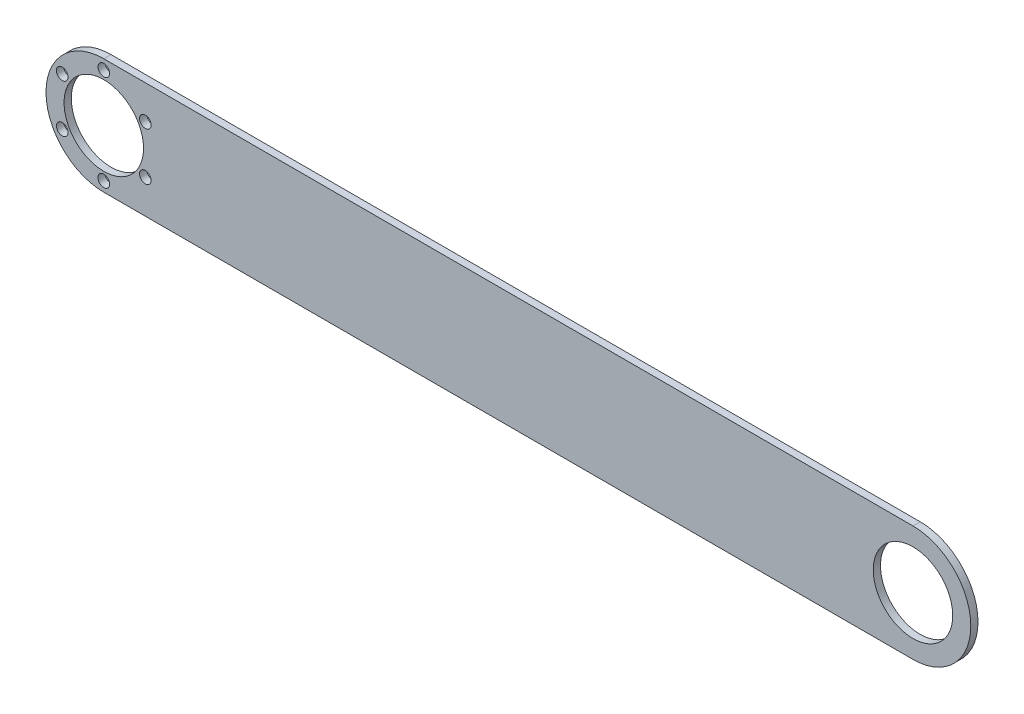
ISO-10303-21;
HEADER;
FILE_DESCRIPTION(('STEP AP214'),'2;1');
FILE_NAME('part.step','',(''),(''),'','','');
FILE_SCHEMA(('AUTOMOTIVE_DESIGN { 1 0 10303 214 1 1 1 1 }'));
ENDSEC;
DATA;
#1=APPLICATION_CONTEXT('core data for automotive mechanical design processes');
#2=APPLICATION_PROTOCOL_DEFINITION('international standard','automotive_design',2000,#1);
#3=PRODUCT_CONTEXT('',#1,'mechanical');
#4=PRODUCT('Part','Part','',(#3));
#5=PRODUCT_RELATED_PRODUCT_CATEGORY('part','',(#4));
#6=PRODUCT_DEFINITION_FORMATION('','',#4);
#7=PRODUCT_DEFINITION_CONTEXT('part definition',#1,'design');
#8=PRODUCT_DEFINITION('design','',#6,#7);
#9=PRODUCT_DEFINITION_SHAPE('','',#8);
#10=(LENGTH_UNIT() NAMED_UNIT(*) SI_UNIT(.MILLI.,.METRE.));
#11=(NAMED_UNIT(*) PLANE_ANGLE_UNIT() SI_UNIT($,.RADIAN.));
#12=(NAMED_UNIT(*) SI_UNIT($,.STERADIAN.) SOLID_ANGLE_UNIT());
#13=UNCERTAINTY_MEASURE_WITH_UNIT(LENGTH_MEASURE(1.E-05),#10,'distance_accuracy_value','');
#14=(GEOMETRIC_REPRESENTATION_CONTEXT(3) GLOBAL_UNCERTAINTY_ASSIGNED_CONTEXT((#13)) GLOBAL_UNIT_ASSIGNED_CONTEXT((#10,
#11,#12)) REPRESENTATION_CONTEXT('',''));
#15=CARTESIAN_POINT('',(0.,0.,0.));
#16=DIRECTION('',(0.,0.,1.));
#17=DIRECTION('',(1.,0.,0.));
#18=AXIS2_PLACEMENT_3D('',#15,#16,#17);
#19=CARTESIAN_POINT('',(0.,25.4,3.175));
#20=DIRECTION('',(0.,0.,-1.));
#21=DIRECTION('',(-1.,0.,0.));
#22=AXIS2_PLACEMENT_3D('',#19,#20,#21);
#23=CYLINDRICAL_SURFACE('',#22,25.4);
#24=CARTESIAN_POINT('',(0.,25.4,0.));
#25=DIRECTION('',(0.,0.,1.));
#26=DIRECTION('',(1.,0.,0.));
#27=AXIS2_PLACEMENT_3D('',#24,#25,#26);
#28=CIRCLE('',#27,25.4);
#29=CARTESIAN_POINT('',(0.,50.8,0.));
#30=VERTEX_POINT('',#29);
#31=CARTESIAN_POINT('',(0.,0.,0.));
#32=VERTEX_POINT('',#31);
#33=EDGE_CURVE('E97',#30,#32,#28,.T.);
#34=ORIENTED_EDGE('',*,*,#33,.T.);
#35=DIRECTION('',(0.,0.,-1.));
#36=VECTOR('',#35,1.);
#37=CARTESIAN_POINT('',(0.,0.,3.175));
#38=LINE('',#37,#36);
#39=CARTESIAN_POINT('',(0.,0.,3.175));
#40=VERTEX_POINT('',#39);
#41=EDGE_CURVE('E11',#40,#32,#38,.T.);
#42=ORIENTED_EDGE('',*,*,#41,.F.);
#43=CARTESIAN_POINT('',(0.,25.4,3.175));
#44=DIRECTION('',(0.,0.,1.));
#45=DIRECTION('',(1.,0.,0.));
#46=AXIS2_PLACEMENT_3D('',#43,#44,#45);
#47=CIRCLE('',#46,25.4);
#48=CARTESIAN_POINT('',(0.,50.8,3.175));
#49=VERTEX_POINT('',#48);
#50=EDGE_CURVE('E85',#49,#40,#47,.T.);
#51=ORIENTED_EDGE('',*,*,#50,.F.);
#52=DIRECTION('',(0.,0.,-1.));
#53=VECTOR('',#52,1.);
#54=CARTESIAN_POINT('',(0.,50.8,3.175));
#55=LINE('',#54,#53);
#56=EDGE_CURVE('E93',#49,#30,#55,.T.);
#57=ORIENTED_EDGE('',*,*,#56,.T.);
#58=EDGE_LOOP('',(#34,#42,#51,#57));
#59=FACE_BOUND('',#58,.T.);
#60=ADVANCED_FACE('F34',(#59),#23,.T.);
#61=CARTESIAN_POINT('',(0.,0.,3.175));
#62=DIRECTION('',(0.,1.,0.));
#63=DIRECTION('',(0.,0.,1.));
#64=AXIS2_PLACEMENT_3D('',#61,#62,#63);
#65=PLANE('',#64);
#66=DIRECTION('',(1.,0.,0.));
#67=VECTOR('',#66,1.);
#68=CARTESIAN_POINT('',(0.,0.,0.));
#69=LINE('',#68,#67);
#70=CARTESIAN_POINT('',(355.6,0.,0.));
#71=VERTEX_POINT('',#70);
#72=EDGE_CURVE('E89',#32,#71,#69,.T.);
#73=ORIENTED_EDGE('',*,*,#72,.T.);
#74=DIRECTION('',(0.,0.,-1.));
#75=VECTOR('',#74,1.);
#76=CARTESIAN_POINT('',(355.6,0.,3.175));
#77=LINE('',#76,#75);
#78=CARTESIAN_POINT('',(355.6,0.,3.175));
#79=VERTEX_POINT('',#78);
#80=EDGE_CURVE('E42',#79,#71,#77,.T.);
#81=ORIENTED_EDGE('',*,*,#80,.F.);
#82=DIRECTION('',(1.,0.,0.));
#83=VECTOR('',#82,1.);
#84=CARTESIAN_POINT('',(0.,0.,3.175));
#85=LINE('',#84,#83);
#86=EDGE_CURVE('E80',#40,#79,#85,.T.);
#87=ORIENTED_EDGE('',*,*,#86,.F.);
#88=ORIENTED_EDGE('',*,*,#41,.T.);
#89=EDGE_LOOP('',(#73,#81,#87,#88));
#90=FACE_BOUND('',#89,.T.);
#91=ADVANCED_FACE('F88',(#90),#65,.F.);
#92=CARTESIAN_POINT('',(355.6,25.4,3.175));
#93=DIRECTION('',(0.,0.,-1.));
#94=DIRECTION('',(-1.,0.,0.));
#95=AXIS2_PLACEMENT_3D('',#92,#93,#94);
#96=CYLINDRICAL_SURFACE('',#95,25.4);
#97=CARTESIAN_POINT('',(355.6,25.4,0.));
#98=DIRECTION('',(0.,0.,1.));
#99=DIRECTION('',(1.,0.,0.));
#100=AXIS2_PLACEMENT_3D('',#97,#98,#99);
#101=CIRCLE('',#100,25.4);
#102=CARTESIAN_POINT('',(355.6,50.8,0.));
#103=VERTEX_POINT('',#102);
#104=EDGE_CURVE('E67',#71,#103,#101,.T.);
#105=ORIENTED_EDGE('',*,*,#104,.T.);
#106=DIRECTION('',(0.,0.,-1.));
#107=VECTOR('',#106,1.);
#108=CARTESIAN_POINT('',(355.6,50.8,3.175));
#109=LINE('',#108,#107);
#110=CARTESIAN_POINT('',(355.6,50.8,3.175));
#111=VERTEX_POINT('',#110);
#112=EDGE_CURVE('E90',#111,#103,#109,.T.);
#113=ORIENTED_EDGE('',*,*,#112,.F.);
#114=CARTESIAN_POINT('',(355.6,25.4,3.175));
#115=DIRECTION('',(0.,0.,1.));
#116=DIRECTION('',(1.,0.,0.));
#117=AXIS2_PLACEMENT_3D('',#114,#115,#116);
#118=CIRCLE('',#117,25.4);
#119=EDGE_CURVE('E83',#79,#111,#118,.T.);
#120=ORIENTED_EDGE('',*,*,#119,.F.);
#121=ORIENTED_EDGE('',*,*,#80,.T.);
#122=EDGE_LOOP('',(#105,#113,#120,#121));
#123=FACE_BOUND('',#122,.T.);
#124=ADVANCED_FACE('F91',(#123),#96,.T.);
#125=CARTESIAN_POINT('',(0.,50.8,3.175));
#126=DIRECTION('',(0.,-1.,0.));
#127=DIRECTION('',(0.,0.,-1.));
#128=AXIS2_PLACEMENT_3D('',#125,#126,#127);
#129=PLANE('',#128);
#130=DIRECTION('',(-1.,0.,0.));
#131=VECTOR('',#130,1.);
#132=CARTESIAN_POINT('',(0.,50.8,0.));
#133=LINE('',#132,#131);
#134=EDGE_CURVE('E73',#103,#30,#133,.T.);
#135=ORIENTED_EDGE('',*,*,#134,.T.);
#136=ORIENTED_EDGE('',*,*,#56,.F.);
#137=DIRECTION('',(-1.,0.,0.));
#138=VECTOR('',#137,1.);
#139=CARTESIAN_POINT('',(0.,50.8,3.175));
#140=LINE('',#139,#138);
#141=EDGE_CURVE('E50',#111,#49,#140,.T.);
#142=ORIENTED_EDGE('',*,*,#141,.F.);
#143=ORIENTED_EDGE('',*,*,#112,.T.);
#144=EDGE_LOOP('',(#135,#136,#142,#143));
#145=FACE_BOUND('',#144,.T.);
#146=ADVANCED_FACE('F105',(#145),#129,.F.);
#147=CARTESIAN_POINT('',(0.,25.4,3.175));
#148=DIRECTION('',(0.,0.,1.));
#149=DIRECTION('',(1.,0.,0.));
#150=AXIS2_PLACEMENT_3D('',#147,#148,#149);
#151=PLANE('',#150);
#152=CARTESIAN_POINT('',(18.2575475625839,35.9410000000005,3.175));
#153=DIRECTION('',(0.,0.,1.));
#154=DIRECTION('',(1.,0.,0.));
#155=AXIS2_PLACEMENT_3D('',#152,#153,#154);
#156=CIRCLE('',#155,2.55269999999999);
#157=CARTESIAN_POINT('',(20.8102475625838,35.9410000000005,3.175));
#158=VERTEX_POINT('',#157);
#159=EDGE_CURVE('E155',#158,#158,#156,.T.);
#160=ORIENTED_EDGE('',*,*,#159,.F.);
#161=EDGE_LOOP('',(#160));
#162=FACE_BOUND('',#161,.T.);
#163=CARTESIAN_POINT('',(18.2575475625844,14.8590000000004,3.175));
#164=DIRECTION('',(0.,0.,1.));
#165=DIRECTION('',(1.,0.,0.));
#166=AXIS2_PLACEMENT_3D('',#163,#164,#165);
#167=CIRCLE('',#166,2.55269999999999);
#168=CARTESIAN_POINT('',(20.8102475625844,14.8590000000004,3.175));
#169=VERTEX_POINT('',#168);
#170=EDGE_CURVE('E149',#169,#169,#167,.T.);
#171=ORIENTED_EDGE('',*,*,#170,.F.);
#172=EDGE_LOOP('',(#171));
#173=FACE_BOUND('',#172,.T.);
#174=CARTESIAN_POINT('',(1.04083093572472E-12,4.318,3.175));
#175=DIRECTION('',(0.,0.,1.));
#176=DIRECTION('',(1.,0.,0.));
#177=AXIS2_PLACEMENT_3D('',#174,#175,#176);
#178=CIRCLE('',#177,2.55269999999999);
#179=CARTESIAN_POINT('',(2.55270000000103,4.318,3.175));
#180=VERTEX_POINT('',#179);
#181=EDGE_CURVE('E143',#180,#180,#178,.T.);
#182=ORIENTED_EDGE('',*,*,#181,.F.);
#183=EDGE_LOOP('',(#182));
#184=FACE_BOUND('',#183,.T.);
#185=CARTESIAN_POINT('',(-18.2575475625827,14.8589999999997,3.175));
#186=DIRECTION('',(0.,0.,1.));
#187=DIRECTION('',(1.,0.,0.));
#188=AXIS2_PLACEMENT_3D('',#185,#186,#187);
#189=CIRCLE('',#188,2.55269999999999);
#190=CARTESIAN_POINT('',(-15.7048475625828,14.8589999999997,3.175));
#191=VERTEX_POINT('',#190);
#192=EDGE_CURVE('E137',#191,#191,#189,.T.);
#193=ORIENTED_EDGE('',*,*,#192,.F.);
#194=EDGE_LOOP('',(#193));
#195=FACE_BOUND('',#194,.T.);
#196=CARTESIAN_POINT('',(-18.2575475625831,35.9409999999997,3.175));
#197=DIRECTION('',(0.,0.,1.));
#198=DIRECTION('',(1.,0.,0.));
#199=AXIS2_PLACEMENT_3D('',#196,#197,#198);
#200=CIRCLE('',#199,2.55269999999999);
#201=CARTESIAN_POINT('',(-15.7048475625831,35.9409999999997,3.175));
#202=VERTEX_POINT('',#201);
#203=EDGE_CURVE('E131',#202,#202,#200,.T.);
#204=ORIENTED_EDGE('',*,*,#203,.F.);
#205=EDGE_LOOP('',(#204));
#206=FACE_BOUND('',#205,.T.);
#207=CARTESIAN_POINT('',(0.,46.482,3.175));
#208=DIRECTION('',(0.,0.,1.));
#209=DIRECTION('',(1.,0.,0.));
#210=AXIS2_PLACEMENT_3D('',#207,#208,#209);
#211=CIRCLE('',#210,2.55269999999999);
#212=CARTESIAN_POINT('',(2.55269999999999,46.482,3.175));
#213=VERTEX_POINT('',#212);
#214=EDGE_CURVE('E125',#213,#213,#211,.T.);
#215=ORIENTED_EDGE('',*,*,#214,.F.);
#216=EDGE_LOOP('',(#215));
#217=FACE_BOUND('',#216,.T.);
#218=CARTESIAN_POINT('',(0.,25.4,3.175));
#219=DIRECTION('',(0.,0.,1.));
#220=DIRECTION('',(1.,0.,0.));
#221=AXIS2_PLACEMENT_3D('',#218,#219,#220);
#222=CIRCLE('',#221,17.4625);
#223=CARTESIAN_POINT('',(17.4625,25.4,3.175));
#224=VERTEX_POINT('',#223);
#225=EDGE_CURVE('E118',#224,#224,#222,.T.);
#226=ORIENTED_EDGE('',*,*,#225,.F.);
#227=EDGE_LOOP('',(#226));
#228=FACE_BOUND('',#227,.T.);
#229=CARTESIAN_POINT('',(355.6,25.4,3.175));
#230=DIRECTION('',(0.,0.,1.));
#231=DIRECTION('',(1.,0.,0.));
#232=AXIS2_PLACEMENT_3D('',#229,#230,#231);
#233=CIRCLE('',#232,17.4625);
#234=CARTESIAN_POINT('',(373.0625,25.4,3.175));
#235=VERTEX_POINT('',#234);
#236=EDGE_CURVE('E111',#235,#235,#233,.T.);
#237=ORIENTED_EDGE('',*,*,#236,.F.);
#238=EDGE_LOOP('',(#237));
#239=FACE_BOUND('',#238,.T.);
#240=ORIENTED_EDGE('',*,*,#50,.T.);
#241=ORIENTED_EDGE('',*,*,#86,.T.);
#242=ORIENTED_EDGE('',*,*,#119,.T.);
#243=ORIENTED_EDGE('',*,*,#141,.T.);
#244=EDGE_LOOP('',(#240,#241,#242,#243));
#245=FACE_BOUND('',#244,.T.);
#246=ADVANCED_FACE('F81',(#162,#173,#184,#195,#206,#217,#228,#239,#245),#151,.T.);
#247=CARTESIAN_POINT('',(0.,25.4,0.));
#248=DIRECTION('',(0.,0.,1.));
#249=DIRECTION('',(1.,0.,0.));
#250=AXIS2_PLACEMENT_3D('',#247,#248,#249);
#251=PLANE('',#250);
#252=CARTESIAN_POINT('',(18.2575475625839,35.9410000000005,0.));
#253=DIRECTION('',(0.,0.,1.));
#254=DIRECTION('',(1.,0.,0.));
#255=AXIS2_PLACEMENT_3D('',#252,#253,#254);
#256=CIRCLE('',#255,2.5527);
#257=CARTESIAN_POINT('',(20.8102475625839,35.9410000000005,0.));
#258=VERTEX_POINT('',#257);
#259=EDGE_CURVE('E152',#258,#258,#256,.T.);
#260=ORIENTED_EDGE('',*,*,#259,.T.);
#261=EDGE_LOOP('',(#260));
#262=FACE_BOUND('',#261,.T.);
#263=CARTESIAN_POINT('',(18.2575475625844,14.8590000000004,0.));
#264=DIRECTION('',(0.,0.,1.));
#265=DIRECTION('',(1.,0.,0.));
#266=AXIS2_PLACEMENT_3D('',#263,#264,#265);
#267=CIRCLE('',#266,2.5527);
#268=CARTESIAN_POINT('',(20.8102475625844,14.8590000000004,0.));
#269=VERTEX_POINT('',#268);
#270=EDGE_CURVE('E146',#269,#269,#267,.T.);
#271=ORIENTED_EDGE('',*,*,#270,.T.);
#272=EDGE_LOOP('',(#271));
#273=FACE_BOUND('',#272,.T.);
#274=CARTESIAN_POINT('',(1.04083093572472E-12,4.318,0.));
#275=DIRECTION('',(0.,0.,1.));
#276=DIRECTION('',(1.,0.,0.));
#277=AXIS2_PLACEMENT_3D('',#274,#275,#276);
#278=CIRCLE('',#277,2.5527);
#279=CARTESIAN_POINT('',(2.55270000000104,4.318,0.));
#280=VERTEX_POINT('',#279);
#281=EDGE_CURVE('E140',#280,#280,#278,.T.);
#282=ORIENTED_EDGE('',*,*,#281,.T.);
#283=EDGE_LOOP('',(#282));
#284=FACE_BOUND('',#283,.T.);
#285=CARTESIAN_POINT('',(-18.2575475625827,14.8589999999997,0.));
#286=DIRECTION('',(0.,0.,1.));
#287=DIRECTION('',(1.,0.,0.));
#288=AXIS2_PLACEMENT_3D('',#285,#286,#287);
#289=CIRCLE('',#288,2.5527);
#290=CARTESIAN_POINT('',(-15.7048475625827,14.8589999999997,0.));
#291=VERTEX_POINT('',#290);
#292=EDGE_CURVE('E134',#291,#291,#289,.T.);
#293=ORIENTED_EDGE('',*,*,#292,.T.);
#294=EDGE_LOOP('',(#293));
#295=FACE_BOUND('',#294,.T.);
#296=CARTESIAN_POINT('',(-18.2575475625831,35.9409999999997,0.));
#297=DIRECTION('',(0.,0.,1.));
#298=DIRECTION('',(1.,0.,0.));
#299=AXIS2_PLACEMENT_3D('',#296,#297,#298);
#300=CIRCLE('',#299,2.5527);
#301=CARTESIAN_POINT('',(-15.7048475625831,35.9409999999997,0.));
#302=VERTEX_POINT('',#301);
#303=EDGE_CURVE('E128',#302,#302,#300,.T.);
#304=ORIENTED_EDGE('',*,*,#303,.T.);
#305=EDGE_LOOP('',(#304));
#306=FACE_BOUND('',#305,.T.);
#307=CARTESIAN_POINT('',(0.,46.482,0.));
#308=DIRECTION('',(0.,0.,1.));
#309=DIRECTION('',(1.,0.,0.));
#310=AXIS2_PLACEMENT_3D('',#307,#308,#309);
#311=CIRCLE('',#310,2.5527);
#312=CARTESIAN_POINT('',(2.5527,46.482,0.));
#313=VERTEX_POINT('',#312);
#314=EDGE_CURVE('E115',#313,#313,#311,.T.);
#315=ORIENTED_EDGE('',*,*,#314,.T.);
#316=EDGE_LOOP('',(#315));
#317=FACE_BOUND('',#316,.T.);
#318=CARTESIAN_POINT('',(0.,25.4,0.));
#319=DIRECTION('',(0.,0.,1.));
#320=DIRECTION('',(1.,0.,0.));
#321=AXIS2_PLACEMENT_3D('',#318,#319,#320);
#322=CIRCLE('',#321,17.4625);
#323=CARTESIAN_POINT('',(17.4625,25.4,0.));
#324=VERTEX_POINT('',#323);
#325=EDGE_CURVE('E100',#324,#324,#322,.T.);
#326=ORIENTED_EDGE('',*,*,#325,.T.);
#327=EDGE_LOOP('',(#326));
#328=FACE_BOUND('',#327,.T.);
#329=CARTESIAN_POINT('',(355.6,25.4,0.));
#330=DIRECTION('',(0.,0.,1.));
#331=DIRECTION('',(1.,0.,0.));
#332=AXIS2_PLACEMENT_3D('',#329,#330,#331);
#333=CIRCLE('',#332,17.4625);
#334=CARTESIAN_POINT('',(373.0625,25.4,0.));
#335=VERTEX_POINT('',#334);
#336=EDGE_CURVE('E114',#335,#335,#333,.T.);
#337=ORIENTED_EDGE('',*,*,#336,.T.);
#338=EDGE_LOOP('',(#337));
#339=FACE_BOUND('',#338,.T.);
#340=ORIENTED_EDGE('',*,*,#33,.F.);
#341=ORIENTED_EDGE('',*,*,#134,.F.);
#342=ORIENTED_EDGE('',*,*,#104,.F.);
#343=ORIENTED_EDGE('',*,*,#72,.F.);
#344=EDGE_LOOP('',(#340,#341,#342,#343));
#345=FACE_BOUND('',#344,.T.);
#346=ADVANCED_FACE('F108',(#262,#273,#284,#295,#306,#317,#328,#339,#345),#251,.F.);
#347=CARTESIAN_POINT('',(355.6,25.4,0.));
#348=DIRECTION('',(0.,0.,1.));
#349=DIRECTION('',(1.,0.,0.));
#350=AXIS2_PLACEMENT_3D('',#347,#348,#349);
#351=CYLINDRICAL_SURFACE('',#350,17.4625);
#352=ORIENTED_EDGE('',*,*,#336,.F.);
#353=EDGE_LOOP('',(#352));
#354=FACE_BOUND('',#353,.T.);
#355=ORIENTED_EDGE('',*,*,#236,.T.);
#356=EDGE_LOOP('',(#355));
#357=FACE_BOUND('',#356,.T.);
#358=ADVANCED_FACE('F178',(#354,#357),#351,.F.);
#359=CARTESIAN_POINT('',(0.,25.4,0.));
#360=DIRECTION('',(0.,0.,1.));
#361=DIRECTION('',(1.,0.,0.));
#362=AXIS2_PLACEMENT_3D('',#359,#360,#361);
#363=CYLINDRICAL_SURFACE('',#362,17.4625);
#364=ORIENTED_EDGE('',*,*,#325,.F.);
#365=EDGE_LOOP('',(#364));
#366=FACE_BOUND('',#365,.T.);
#367=ORIENTED_EDGE('',*,*,#225,.T.);
#368=EDGE_LOOP('',(#367));
#369=FACE_BOUND('',#368,.T.);
#370=ADVANCED_FACE('F180',(#366,#369),#363,.F.);
#371=CARTESIAN_POINT('',(0.,46.482,3.175));
#372=DIRECTION('',(0.,0.,1.));
#373=DIRECTION('',(1.,0.,0.));
#374=AXIS2_PLACEMENT_3D('',#371,#372,#373);
#375=CYLINDRICAL_SURFACE('',#374,2.55269999999999);
#376=ORIENTED_EDGE('',*,*,#314,.F.);
#377=EDGE_LOOP('',(#376));
#378=FACE_BOUND('',#377,.T.);
#379=ORIENTED_EDGE('',*,*,#214,.T.);
#380=EDGE_LOOP('',(#379));
#381=FACE_BOUND('',#380,.T.);
#382=ADVANCED_FACE('F187',(#378,#381),#375,.F.);
#383=CARTESIAN_POINT('',(-18.2575475625831,35.9409999999997,3.175));
#384=DIRECTION('',(0.,0.,1.));
#385=DIRECTION('',(1.,0.,0.));
#386=AXIS2_PLACEMENT_3D('',#383,#384,#385);
#387=CYLINDRICAL_SURFACE('',#386,2.55269999999999);
#388=ORIENTED_EDGE('',*,*,#303,.F.);
#389=EDGE_LOOP('',(#388));
#390=FACE_BOUND('',#389,.T.);
#391=ORIENTED_EDGE('',*,*,#203,.T.);
#392=EDGE_LOOP('',(#391));
#393=FACE_BOUND('',#392,.T.);
#394=ADVANCED_FACE('F226',(#390,#393),#387,.F.);
#395=CARTESIAN_POINT('',(-18.2575475625827,14.8589999999997,3.175));
#396=DIRECTION('',(0.,0.,1.));
#397=DIRECTION('',(1.,0.,0.));
#398=AXIS2_PLACEMENT_3D('',#395,#396,#397);
#399=CYLINDRICAL_SURFACE('',#398,2.55269999999999);
#400=ORIENTED_EDGE('',*,*,#292,.F.);
#401=EDGE_LOOP('',(#400));
#402=FACE_BOUND('',#401,.T.);
#403=ORIENTED_EDGE('',*,*,#192,.T.);
#404=EDGE_LOOP('',(#403));
#405=FACE_BOUND('',#404,.T.);
#406=ADVANCED_FACE('F237',(#402,#405),#399,.F.);
#407=CARTESIAN_POINT('',(1.04083093572472E-12,4.318,3.175));
#408=DIRECTION('',(0.,0.,1.));
#409=DIRECTION('',(1.,0.,0.));
#410=AXIS2_PLACEMENT_3D('',#407,#408,#409);
#411=CYLINDRICAL_SURFACE('',#410,2.55269999999999);
#412=ORIENTED_EDGE('',*,*,#281,.F.);
#413=EDGE_LOOP('',(#412));
#414=FACE_BOUND('',#413,.T.);
#415=ORIENTED_EDGE('',*,*,#181,.T.);
#416=EDGE_LOOP('',(#415));
#417=FACE_BOUND('',#416,.T.);
#418=ADVANCED_FACE('F247',(#414,#417),#411,.F.);
#419=CARTESIAN_POINT('',(18.2575475625844,14.8590000000004,3.175));
#420=DIRECTION('',(0.,0.,1.));
#421=DIRECTION('',(1.,0.,0.));
#422=AXIS2_PLACEMENT_3D('',#419,#420,#421);
#423=CYLINDRICAL_SURFACE('',#422,2.55269999999999);
#424=ORIENTED_EDGE('',*,*,#270,.F.);
#425=EDGE_LOOP('',(#424));
#426=FACE_BOUND('',#425,.T.);
#427=ORIENTED_EDGE('',*,*,#170,.T.);
#428=EDGE_LOOP('',(#427));
#429=FACE_BOUND('',#428,.T.);
#430=ADVANCED_FACE('F257',(#426,#429),#423,.F.);
#431=CARTESIAN_POINT('',(18.2575475625839,35.9410000000005,3.175));
#432=DIRECTION('',(0.,0.,1.));
#433=DIRECTION('',(1.,0.,0.));
#434=AXIS2_PLACEMENT_3D('',#431,#432,#433);
#435=CYLINDRICAL_SURFACE('',#434,2.55269999999999);
#436=ORIENTED_EDGE('',*,*,#259,.F.);
#437=EDGE_LOOP('',(#436));
#438=FACE_BOUND('',#437,.T.);
#439=ORIENTED_EDGE('',*,*,#159,.T.);
#440=EDGE_LOOP('',(#439));
#441=FACE_BOUND('',#440,.T.);
#442=ADVANCED_FACE('F159',(#438,#441),#435,.F.);
#443=CLOSED_SHELL('',(#60,#91,#124,#146,#246,#346,#358,#370,#382,#394,#406,#418,#430,#442));
#444=MANIFOLD_SOLID_BREP('B2',#443);
#445=ADVANCED_BREP_SHAPE_REPRESENTATION('',(#18,#444),#14);
#446=SHAPE_DEFINITION_REPRESENTATION(#9,#445);
ENDSEC;
END-ISO-10303-21;
